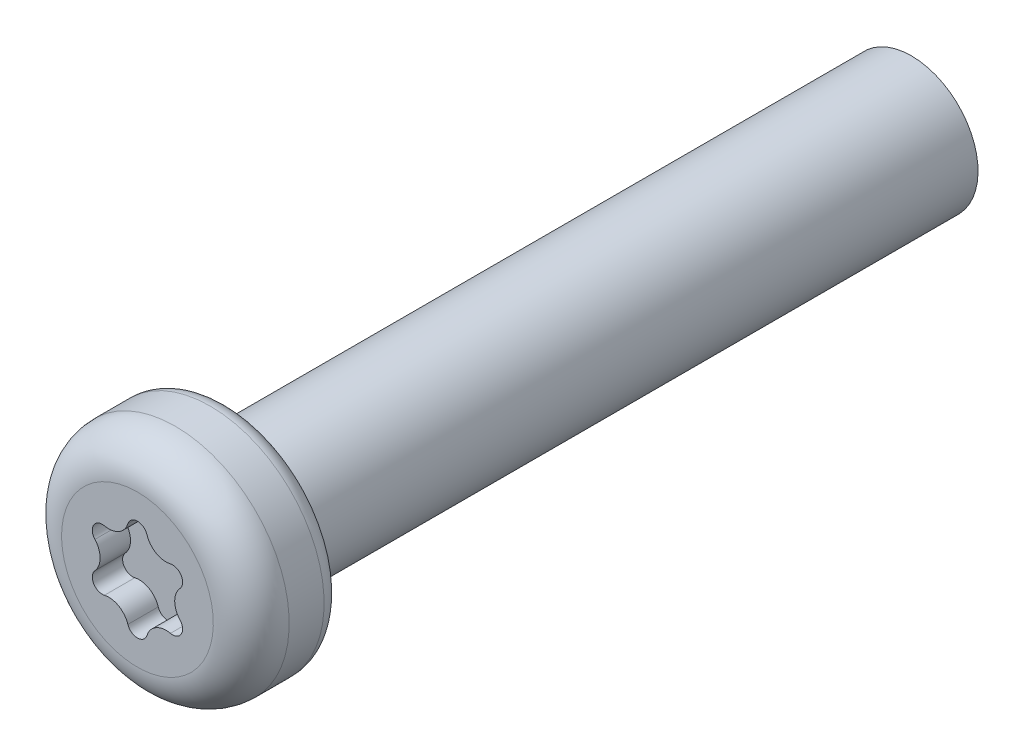
ISO-10303-21;
HEADER;
FILE_DESCRIPTION(('STEP AP214'),'2;1');
FILE_NAME('part.step','',(''),(''),'','','');
FILE_SCHEMA(('AUTOMOTIVE_DESIGN { 1 0 10303 214 1 1 1 1 }'));
ENDSEC;
DATA;
#1=APPLICATION_CONTEXT('core data for automotive mechanical design processes');
#2=APPLICATION_PROTOCOL_DEFINITION('international standard','automotive_design',2000,#1);
#3=PRODUCT_CONTEXT('',#1,'mechanical');
#4=PRODUCT('Part','Part','',(#3));
#5=PRODUCT_RELATED_PRODUCT_CATEGORY('part','',(#4));
#6=PRODUCT_DEFINITION_FORMATION('','',#4);
#7=PRODUCT_DEFINITION_CONTEXT('part definition',#1,'design');
#8=PRODUCT_DEFINITION('design','',#6,#7);
#9=PRODUCT_DEFINITION_SHAPE('','',#8);
#10=(LENGTH_UNIT() NAMED_UNIT(*) SI_UNIT(.MILLI.,.METRE.));
#11=(NAMED_UNIT(*) PLANE_ANGLE_UNIT() SI_UNIT($,.RADIAN.));
#12=(NAMED_UNIT(*) SI_UNIT($,.STERADIAN.) SOLID_ANGLE_UNIT());
#13=UNCERTAINTY_MEASURE_WITH_UNIT(LENGTH_MEASURE(1.E-05),#10,'distance_accuracy_value','');
#14=(GEOMETRIC_REPRESENTATION_CONTEXT(3) GLOBAL_UNCERTAINTY_ASSIGNED_CONTEXT((#13)) GLOBAL_UNIT_ASSIGNED_CONTEXT((#10,
#11,#12)) REPRESENTATION_CONTEXT('',''));
#15=CARTESIAN_POINT('',(0.,0.,0.));
#16=DIRECTION('',(0.,0.,1.));
#17=DIRECTION('',(1.,0.,0.));
#18=AXIS2_PLACEMENT_3D('',#15,#16,#17);
#19=CARTESIAN_POINT('',(0.,0.,0.));
#20=DIRECTION('',(0.,0.,1.));
#21=DIRECTION('',(1.,0.,0.));
#22=AXIS2_PLACEMENT_3D('',#19,#20,#21);
#23=PLANE('',#22);
#24=CARTESIAN_POINT('',(0.,0.,0.));
#25=DIRECTION('',(0.,0.,1.));
#26=DIRECTION('',(1.,0.,0.));
#27=AXIS2_PLACEMENT_3D('',#24,#25,#26);
#28=CIRCLE('',#27,1.17);
#29=CARTESIAN_POINT('',(1.17,0.,0.));
#30=VERTEX_POINT('',#29);
#31=EDGE_CURVE('E45',#30,#30,#28,.F.);
#32=ORIENTED_EDGE('',*,*,#31,.F.);
#33=EDGE_LOOP('',(#32));
#34=FACE_BOUND('',#33,.T.);
#35=CARTESIAN_POINT('',(0.,0.,0.));
#36=DIRECTION('',(0.,0.,-1.));
#37=DIRECTION('',(0.,1.,0.));
#38=AXIS2_PLACEMENT_3D('',#35,#36,#37);
#39=CIRCLE('',#38,1.68);
#40=CARTESIAN_POINT('',(0.,1.68,0.));
#41=VERTEX_POINT('',#40);
#42=EDGE_CURVE('E131',#41,#41,#39,.T.);
#43=ORIENTED_EDGE('',*,*,#42,.T.);
#44=EDGE_LOOP('',(#43));
#45=FACE_BOUND('',#44,.T.);
#46=ADVANCED_FACE('F36',(#34,#45),#23,.F.);
#47=CARTESIAN_POINT('',(0.,0.,0.));
#48=DIRECTION('',(0.,0.,-1.));
#49=DIRECTION('',(0.,1.,0.));
#50=AXIS2_PLACEMENT_3D('',#47,#48,#49);
#51=CYLINDRICAL_SURFACE('',#50,1.17);
#52=ORIENTED_EDGE('',*,*,#31,.T.);
#53=EDGE_LOOP('',(#52));
#54=FACE_BOUND('',#53,.T.);
#55=CARTESIAN_POINT('',(0.,0.,-12.));
#56=DIRECTION('',(0.,0.,-1.));
#57=DIRECTION('',(0.,1.,0.));
#58=AXIS2_PLACEMENT_3D('',#55,#56,#57);
#59=CIRCLE('',#58,1.17);
#60=CARTESIAN_POINT('',(0.,1.17,-12.));
#61=VERTEX_POINT('',#60);
#62=EDGE_CURVE('E11',#61,#61,#59,.T.);
#63=ORIENTED_EDGE('',*,*,#62,.F.);
#64=EDGE_LOOP('',(#63));
#65=FACE_BOUND('',#64,.T.);
#66=ADVANCED_FACE('F38',(#54,#65),#51,.T.);
#67=CARTESIAN_POINT('',(0.,0.,-12.));
#68=DIRECTION('',(0.,0.,-1.));
#69=DIRECTION('',(0.,1.,0.));
#70=AXIS2_PLACEMENT_3D('',#67,#68,#69);
#71=PLANE('',#70);
#72=ORIENTED_EDGE('',*,*,#62,.T.);
#73=EDGE_LOOP('',(#72));
#74=FACE_BOUND('',#73,.T.);
#75=ADVANCED_FACE('F150',(#74),#71,.T.);
#76=CARTESIAN_POINT('',(0.,0.,0.32));
#77=DIRECTION('',(0.,0.,-1.));
#78=DIRECTION('',(0.,1.,0.));
#79=AXIS2_PLACEMENT_3D('',#76,#77,#78);
#80=TOROIDAL_SURFACE('',#79,1.68,0.32);
#81=ORIENTED_EDGE('',*,*,#42,.F.);
#82=EDGE_LOOP('',(#81));
#83=FACE_BOUND('',#82,.T.);
#84=CARTESIAN_POINT('',(0.,0.,0.32));
#85=DIRECTION('',(0.,0.,-1.));
#86=DIRECTION('',(0.,1.,0.));
#87=AXIS2_PLACEMENT_3D('',#84,#85,#86);
#88=CIRCLE('',#87,2.);
#89=CARTESIAN_POINT('',(0.,2.,0.32));
#90=VERTEX_POINT('',#89);
#91=EDGE_CURVE('E128',#90,#90,#88,.T.);
#92=ORIENTED_EDGE('',*,*,#91,.T.);
#93=EDGE_LOOP('',(#92));
#94=FACE_BOUND('',#93,.T.);
#95=ADVANCED_FACE('F146',(#83,#94),#80,.T.);
#96=CARTESIAN_POINT('',(0.,0.,1.6));
#97=DIRECTION('',(0.,0.,-1.));
#98=DIRECTION('',(-1.,0.,0.));
#99=AXIS2_PLACEMENT_3D('',#96,#97,#98);
#100=CYLINDRICAL_SURFACE('',#99,2.);
#101=CARTESIAN_POINT('',(0.,0.,0.933333333333333));
#102=DIRECTION('',(0.,0.,-1.));
#103=DIRECTION('',(0.,1.,0.));
#104=AXIS2_PLACEMENT_3D('',#101,#102,#103);
#105=CIRCLE('',#104,2.);
#106=CARTESIAN_POINT('',(0.,2.,0.933333333333333));
#107=VERTEX_POINT('',#106);
#108=EDGE_CURVE('E124',#107,#107,#105,.T.);
#109=ORIENTED_EDGE('',*,*,#108,.T.);
#110=EDGE_LOOP('',(#109));
#111=FACE_BOUND('',#110,.T.);
#112=ORIENTED_EDGE('',*,*,#91,.F.);
#113=EDGE_LOOP('',(#112));
#114=FACE_BOUND('',#113,.T.);
#115=ADVANCED_FACE('F149',(#111,#114),#100,.T.);
#116=CARTESIAN_POINT('',(0.,0.,0.933333333333333));
#117=DIRECTION('',(0.,0.,-1.));
#118=DIRECTION('',(0.,1.,0.));
#119=AXIS2_PLACEMENT_3D('',#116,#117,#118);
#120=TOROIDAL_SURFACE('',#119,1.33333333333333,0.666666666666667);
#121=ORIENTED_EDGE('',*,*,#108,.F.);
#122=EDGE_LOOP('',(#121));
#123=FACE_BOUND('',#122,.T.);
#124=CARTESIAN_POINT('',(0.,0.,1.6));
#125=DIRECTION('',(0.,0.,-1.));
#126=DIRECTION('',(0.,1.,0.));
#127=AXIS2_PLACEMENT_3D('',#124,#125,#126);
#128=CIRCLE('',#127,1.33333333333333);
#129=CARTESIAN_POINT('',(0.,1.33333333333333,1.6));
#130=VERTEX_POINT('',#129);
#131=EDGE_CURVE('E134',#130,#130,#128,.T.);
#132=ORIENTED_EDGE('',*,*,#131,.T.);
#133=EDGE_LOOP('',(#132));
#134=FACE_BOUND('',#133,.T.);
#135=ADVANCED_FACE('F155',(#123,#134),#120,.T.);
#136=CARTESIAN_POINT('',(0.,0.,1.6));
#137=DIRECTION('',(0.,0.,1.));
#138=DIRECTION('',(1.,0.,0.));
#139=AXIS2_PLACEMENT_3D('',#136,#137,#138);
#140=PLANE('',#139);
#141=CARTESIAN_POINT('',(0.503453491609989,0.87200702671645,1.6));
#142=DIRECTION('',(0.,0.,-1.));
#143=DIRECTION('',(1.,0.,0.));
#144=AXIS2_PLACEMENT_3D('',#141,#142,#143);
#145=CIRCLE('',#144,0.352);
#146=CARTESIAN_POINT('',(0.579404422438957,0.528298638535112,1.6));
#147=VERTEX_POINT('',#146);
#148=CARTESIAN_POINT('',(0.167817830536663,0.765928268164742,1.6));
#149=VERTEX_POINT('',#148);
#150=EDGE_CURVE('E83',#147,#149,#145,.T.);
#151=ORIENTED_EDGE('',*,*,#150,.F.);
#152=CARTESIAN_POINT('',(0.617379887853441,0.356444444444443,1.6));
#153=DIRECTION('',(0.,0.,1.));
#154=DIRECTION('',(-0.499999999999998,0.86602540378444,0.));
#155=AXIS2_PLACEMENT_3D('',#152,#153,#154);
#156=CIRCLE('',#155,0.176);
#157=CARTESIAN_POINT('',(0.747222252975619,0.237629629629627,1.6));
#158=VERTEX_POINT('',#157);
#159=EDGE_CURVE('E88',#158,#147,#156,.T.);
#160=ORIENTED_EDGE('',*,*,#159,.F.);
#161=CARTESIAN_POINT('',(1.00690698321998,0.,1.6));
#162=DIRECTION('',(0.,0.,-1.));
#163=DIRECTION('',(0.499999999999998,-0.86602540378444,0.));
#164=AXIS2_PLACEMENT_3D('',#161,#162,#163);
#165=CIRCLE('',#164,0.352);
#166=CARTESIAN_POINT('',(0.747222252975618,-0.237629629629633,1.6));
#167=VERTEX_POINT('',#166);
#168=EDGE_CURVE('E102',#167,#158,#165,.T.);
#169=ORIENTED_EDGE('',*,*,#168,.F.);
#170=CARTESIAN_POINT('',(0.617379887853438,-0.356444444444448,1.6));
#171=DIRECTION('',(0.,0.,1.));
#172=DIRECTION('',(0.500000000000004,0.866025403784436,0.));
#173=AXIS2_PLACEMENT_3D('',#170,#171,#172);
#174=CIRCLE('',#173,0.176);
#175=CARTESIAN_POINT('',(0.579404422438953,-0.528298638535117,1.6));
#176=VERTEX_POINT('',#175);
#177=EDGE_CURVE('E411',#176,#167,#174,.T.);
#178=ORIENTED_EDGE('',*,*,#177,.F.);
#179=CARTESIAN_POINT('',(0.503453491609983,-0.872007026716454,1.6));
#180=DIRECTION('',(0.,0.,-1.));
#181=DIRECTION('',(-0.500000000000004,-0.866025403784436,0.));
#182=AXIS2_PLACEMENT_3D('',#179,#180,#181);
#183=CIRCLE('',#182,0.352);
#184=CARTESIAN_POINT('',(0.167817830536658,-0.765928268164744,1.6));
#185=VERTEX_POINT('',#184);
#186=EDGE_CURVE('E404',#185,#176,#183,.T.);
#187=ORIENTED_EDGE('',*,*,#186,.F.);
#188=CARTESIAN_POINT('',(0.,-0.712888888888889,1.6));
#189=DIRECTION('',(0.,0.,1.));
#190=DIRECTION('',(1.,0.,0.));
#191=AXIS2_PLACEMENT_3D('',#188,#189,#190);
#192=CIRCLE('',#191,0.176);
#193=CARTESIAN_POINT('',(-0.167817830536668,-0.765928268164742,1.6));
#194=VERTEX_POINT('',#193);
#195=EDGE_CURVE('E393',#194,#185,#192,.T.);
#196=ORIENTED_EDGE('',*,*,#195,.F.);
#197=CARTESIAN_POINT('',(-0.503453491609995,-0.872007026716447,1.6));
#198=DIRECTION('',(0.,0.,-1.));
#199=DIRECTION('',(-1.,0.,0.));
#200=AXIS2_PLACEMENT_3D('',#197,#198,#199);
#201=CIRCLE('',#200,0.352);
#202=CARTESIAN_POINT('',(-0.57940442243896,-0.528298638535108,1.6));
#203=VERTEX_POINT('',#202);
#204=EDGE_CURVE('E385',#203,#194,#201,.T.);
#205=ORIENTED_EDGE('',*,*,#204,.F.);
#206=CARTESIAN_POINT('',(-0.617379887853443,-0.356444444444439,1.6));
#207=DIRECTION('',(0.,0.,1.));
#208=DIRECTION('',(0.499999999999992,-0.866025403784443,0.));
#209=AXIS2_PLACEMENT_3D('',#206,#207,#208);
#210=CIRCLE('',#209,0.176);
#211=CARTESIAN_POINT('',(-0.747222252975621,-0.237629629629622,1.6));
#212=VERTEX_POINT('',#211);
#213=EDGE_CURVE('E372',#212,#203,#210,.T.);
#214=ORIENTED_EDGE('',*,*,#213,.F.);
#215=CARTESIAN_POINT('',(-1.00690698321998,0.,1.6));
#216=DIRECTION('',(0.,0.,-1.));
#217=DIRECTION('',(-0.499999999999992,0.866025403784443,0.));
#218=AXIS2_PLACEMENT_3D('',#215,#216,#217);
#219=CIRCLE('',#218,0.352);
#220=CARTESIAN_POINT('',(-0.747222252975616,0.237629629629638,1.6));
#221=VERTEX_POINT('',#220);
#222=EDGE_CURVE('E368',#221,#212,#219,.T.);
#223=ORIENTED_EDGE('',*,*,#222,.F.);
#224=CARTESIAN_POINT('',(-0.617379887853436,0.356444444444452,1.6));
#225=DIRECTION('',(0.,0.,1.));
#226=DIRECTION('',(-0.50000000000001,-0.866025403784433,0.));
#227=AXIS2_PLACEMENT_3D('',#224,#225,#226);
#228=CIRCLE('',#227,0.176);
#229=CARTESIAN_POINT('',(-0.579404422438949,0.52829863853512,1.6));
#230=VERTEX_POINT('',#229);
#231=EDGE_CURVE('E352',#230,#221,#228,.T.);
#232=ORIENTED_EDGE('',*,*,#231,.F.);
#233=CARTESIAN_POINT('',(-0.503453491609989,0.87200702671645,1.6));
#234=DIRECTION('',(0.,0.,-1.));
#235=DIRECTION('',(1.,0.,0.));
#236=AXIS2_PLACEMENT_3D('',#233,#234,#235);
#237=CIRCLE('',#236,0.352);
#238=CARTESIAN_POINT('',(-0.167817830536663,0.765928268164742,1.6));
#239=VERTEX_POINT('',#238);
#240=EDGE_CURVE('E114',#239,#230,#237,.T.);
#241=ORIENTED_EDGE('',*,*,#240,.F.);
#242=CARTESIAN_POINT('',(0.,0.712888888888889,1.6));
#243=DIRECTION('',(0.,0.,1.));
#244=DIRECTION('',(-1.,0.,0.));
#245=AXIS2_PLACEMENT_3D('',#242,#243,#244);
#246=CIRCLE('',#245,0.176);
#247=EDGE_CURVE('E90',#149,#239,#246,.T.);
#248=ORIENTED_EDGE('',*,*,#247,.F.);
#249=EDGE_LOOP('',(#151,#160,#169,#178,#187,#196,#205,#214,#223,#232,#241,#248));
#250=FACE_BOUND('',#249,.T.);
#251=ORIENTED_EDGE('',*,*,#131,.F.);
#252=EDGE_LOOP('',(#251));
#253=FACE_BOUND('',#252,.T.);
#254=ADVANCED_FACE('F84',(#250,#253),#140,.T.);
#255=CARTESIAN_POINT('',(-0.503453491609989,0.87200702671645,1.06666666666667));
#256=DIRECTION('',(0.,0.,1.));
#257=DIRECTION('',(1.,0.,0.));
#258=AXIS2_PLACEMENT_3D('',#255,#256,#257);
#259=CYLINDRICAL_SURFACE('',#258,0.352);
#260=ORIENTED_EDGE('',*,*,#240,.T.);
#261=DIRECTION('',(0.,0.,1.));
#262=VECTOR('',#261,1.);
#263=CARTESIAN_POINT('',(-0.579404422438949,0.52829863853512,1.06666666666667));
#264=LINE('',#263,#262);
#265=CARTESIAN_POINT('',(-0.579404422438949,0.52829863853512,1.06666666666667));
#266=VERTEX_POINT('',#265);
#267=EDGE_CURVE('E361',#266,#230,#264,.T.);
#268=ORIENTED_EDGE('',*,*,#267,.F.);
#269=CARTESIAN_POINT('',(-0.503453491609989,0.87200702671645,1.06666666666667));
#270=DIRECTION('',(0.,0.,-1.));
#271=DIRECTION('',(1.,0.,0.));
#272=AXIS2_PLACEMENT_3D('',#269,#270,#271);
#273=CIRCLE('',#272,0.352);
#274=CARTESIAN_POINT('',(-0.167817830536663,0.765928268164742,1.06666666666667));
#275=VERTEX_POINT('',#274);
#276=EDGE_CURVE('E117',#275,#266,#273,.T.);
#277=ORIENTED_EDGE('',*,*,#276,.F.);
#278=DIRECTION('',(0.,0.,1.));
#279=VECTOR('',#278,1.);
#280=CARTESIAN_POINT('',(-0.167817830536663,0.765928268164742,1.06666666666667));
#281=LINE('',#280,#279);
#282=EDGE_CURVE('E53',#275,#239,#281,.T.);
#283=ORIENTED_EDGE('',*,*,#282,.T.);
#284=EDGE_LOOP('',(#260,#268,#277,#283));
#285=FACE_BOUND('',#284,.T.);
#286=ADVANCED_FACE('F207',(#285),#259,.T.);
#287=CARTESIAN_POINT('',(0.,0.712888888888889,1.06666666666667));
#288=DIRECTION('',(0.,0.,1.));
#289=DIRECTION('',(1.,0.,0.));
#290=AXIS2_PLACEMENT_3D('',#287,#288,#289);
#291=CYLINDRICAL_SURFACE('',#290,0.176);
#292=ORIENTED_EDGE('',*,*,#247,.T.);
#293=ORIENTED_EDGE('',*,*,#282,.F.);
#294=CARTESIAN_POINT('',(0.,0.712888888888889,1.06666666666667));
#295=DIRECTION('',(0.,0.,1.));
#296=DIRECTION('',(-1.,0.,0.));
#297=AXIS2_PLACEMENT_3D('',#294,#295,#296);
#298=CIRCLE('',#297,0.176);
#299=CARTESIAN_POINT('',(0.167817830536663,0.765928268164742,1.06666666666667));
#300=VERTEX_POINT('',#299);
#301=EDGE_CURVE('E113',#300,#275,#298,.T.);
#302=ORIENTED_EDGE('',*,*,#301,.F.);
#303=DIRECTION('',(0.,0.,1.));
#304=VECTOR('',#303,1.);
#305=CARTESIAN_POINT('',(0.167817830536663,0.765928268164742,1.06666666666667));
#306=LINE('',#305,#304);
#307=EDGE_CURVE('E61',#300,#149,#306,.T.);
#308=ORIENTED_EDGE('',*,*,#307,.T.);
#309=EDGE_LOOP('',(#292,#293,#302,#308));
#310=FACE_BOUND('',#309,.T.);
#311=ADVANCED_FACE('F202',(#310),#291,.F.);
#312=CARTESIAN_POINT('',(0.503453491609989,0.87200702671645,1.06666666666667));
#313=DIRECTION('',(0.,0.,1.));
#314=DIRECTION('',(1.,0.,0.));
#315=AXIS2_PLACEMENT_3D('',#312,#313,#314);
#316=CYLINDRICAL_SURFACE('',#315,0.352);
#317=ORIENTED_EDGE('',*,*,#150,.T.);
#318=ORIENTED_EDGE('',*,*,#307,.F.);
#319=CARTESIAN_POINT('',(0.503453491609989,0.87200702671645,1.06666666666667));
#320=DIRECTION('',(0.,0.,-1.));
#321=DIRECTION('',(1.,0.,0.));
#322=AXIS2_PLACEMENT_3D('',#319,#320,#321);
#323=CIRCLE('',#322,0.352);
#324=CARTESIAN_POINT('',(0.579404422438957,0.528298638535112,1.06666666666667));
#325=VERTEX_POINT('',#324);
#326=EDGE_CURVE('E69',#325,#300,#323,.T.);
#327=ORIENTED_EDGE('',*,*,#326,.F.);
#328=DIRECTION('',(0.,0.,1.));
#329=VECTOR('',#328,1.);
#330=CARTESIAN_POINT('',(0.579404422438957,0.528298638535112,1.06666666666667));
#331=LINE('',#330,#329);
#332=EDGE_CURVE('E91',#325,#147,#331,.T.);
#333=ORIENTED_EDGE('',*,*,#332,.T.);
#334=EDGE_LOOP('',(#317,#318,#327,#333));
#335=FACE_BOUND('',#334,.T.);
#336=ADVANCED_FACE('F93',(#335),#316,.T.);
#337=CARTESIAN_POINT('',(0.503453491609989,0.87200702671645,1.06666666666667));
#338=DIRECTION('',(0.,0.,1.));
#339=DIRECTION('',(1.,0.,0.));
#340=AXIS2_PLACEMENT_3D('',#337,#338,#339);
#341=PLANE('',#340);
#342=CARTESIAN_POINT('',(0.617379887853441,0.356444444444443,1.06666666666667));
#343=DIRECTION('',(0.,0.,1.));
#344=DIRECTION('',(-0.499999999999998,0.86602540378444,0.));
#345=AXIS2_PLACEMENT_3D('',#342,#343,#344);
#346=CIRCLE('',#345,0.176);
#347=CARTESIAN_POINT('',(0.747222252975619,0.237629629629627,1.06666666666667));
#348=VERTEX_POINT('',#347);
#349=EDGE_CURVE('E105',#348,#325,#346,.T.);
#350=ORIENTED_EDGE('',*,*,#349,.T.);
#351=ORIENTED_EDGE('',*,*,#326,.T.);
#352=ORIENTED_EDGE('',*,*,#301,.T.);
#353=ORIENTED_EDGE('',*,*,#276,.T.);
#354=CARTESIAN_POINT('',(-0.617379887853436,0.356444444444452,1.06666666666667));
#355=DIRECTION('',(0.,0.,1.));
#356=DIRECTION('',(-0.50000000000001,-0.866025403784433,0.));
#357=AXIS2_PLACEMENT_3D('',#354,#355,#356);
#358=CIRCLE('',#357,0.176);
#359=CARTESIAN_POINT('',(-0.747222252975616,0.237629629629638,1.06666666666667));
#360=VERTEX_POINT('',#359);
#361=EDGE_CURVE('E364',#266,#360,#358,.T.);
#362=ORIENTED_EDGE('',*,*,#361,.T.);
#363=CARTESIAN_POINT('',(-1.00690698321998,0.,1.06666666666667));
#364=DIRECTION('',(0.,0.,-1.));
#365=DIRECTION('',(-0.499999999999992,0.866025403784443,0.));
#366=AXIS2_PLACEMENT_3D('',#363,#364,#365);
#367=CIRCLE('',#366,0.352);
#368=CARTESIAN_POINT('',(-0.747222252975621,-0.237629629629622,1.06666666666667));
#369=VERTEX_POINT('',#368);
#370=EDGE_CURVE('E375',#360,#369,#367,.T.);
#371=ORIENTED_EDGE('',*,*,#370,.T.);
#372=CARTESIAN_POINT('',(-0.617379887853443,-0.356444444444439,1.06666666666667));
#373=DIRECTION('',(0.,0.,1.));
#374=DIRECTION('',(0.499999999999992,-0.866025403784443,0.));
#375=AXIS2_PLACEMENT_3D('',#372,#373,#374);
#376=CIRCLE('',#375,0.176);
#377=CARTESIAN_POINT('',(-0.57940442243896,-0.528298638535108,1.06666666666667));
#378=VERTEX_POINT('',#377);
#379=EDGE_CURVE('E379',#369,#378,#376,.T.);
#380=ORIENTED_EDGE('',*,*,#379,.T.);
#381=CARTESIAN_POINT('',(-0.503453491609995,-0.872007026716446,1.06666666666667));
#382=DIRECTION('',(0.,0.,-1.));
#383=DIRECTION('',(-1.,0.,0.));
#384=AXIS2_PLACEMENT_3D('',#381,#382,#383);
#385=CIRCLE('',#384,0.352);
#386=CARTESIAN_POINT('',(-0.167817830536668,-0.765928268164742,1.06666666666667));
#387=VERTEX_POINT('',#386);
#388=EDGE_CURVE('E389',#378,#387,#385,.T.);
#389=ORIENTED_EDGE('',*,*,#388,.T.);
#390=CARTESIAN_POINT('',(0.,-0.712888888888889,1.06666666666667));
#391=DIRECTION('',(0.,0.,1.));
#392=DIRECTION('',(1.,0.,0.));
#393=AXIS2_PLACEMENT_3D('',#390,#391,#392);
#394=CIRCLE('',#393,0.176);
#395=CARTESIAN_POINT('',(0.167817830536658,-0.765928268164744,1.06666666666667));
#396=VERTEX_POINT('',#395);
#397=EDGE_CURVE('E392',#387,#396,#394,.T.);
#398=ORIENTED_EDGE('',*,*,#397,.T.);
#399=CARTESIAN_POINT('',(0.503453491609983,-0.872007026716454,1.06666666666667));
#400=DIRECTION('',(0.,0.,-1.));
#401=DIRECTION('',(-0.500000000000004,-0.866025403784436,0.));
#402=AXIS2_PLACEMENT_3D('',#399,#400,#401);
#403=CIRCLE('',#402,0.352);
#404=CARTESIAN_POINT('',(0.579404422438953,-0.528298638535116,1.06666666666667));
#405=VERTEX_POINT('',#404);
#406=EDGE_CURVE('E407',#396,#405,#403,.T.);
#407=ORIENTED_EDGE('',*,*,#406,.T.);
#408=CARTESIAN_POINT('',(0.617379887853438,-0.356444444444448,1.06666666666667));
#409=DIRECTION('',(0.,0.,1.));
#410=DIRECTION('',(0.500000000000004,0.866025403784436,0.));
#411=AXIS2_PLACEMENT_3D('',#408,#409,#410);
#412=CIRCLE('',#411,0.176);
#413=CARTESIAN_POINT('',(0.747222252975618,-0.237629629629633,1.06666666666667));
#414=VERTEX_POINT('',#413);
#415=EDGE_CURVE('E410',#405,#414,#412,.T.);
#416=ORIENTED_EDGE('',*,*,#415,.T.);
#417=CARTESIAN_POINT('',(1.00690698321998,0.,1.06666666666667));
#418=DIRECTION('',(0.,0.,-1.));
#419=DIRECTION('',(0.499999999999998,-0.86602540378444,0.));
#420=AXIS2_PLACEMENT_3D('',#417,#418,#419);
#421=CIRCLE('',#420,0.352);
#422=EDGE_CURVE('E101',#414,#348,#421,.T.);
#423=ORIENTED_EDGE('',*,*,#422,.T.);
#424=EDGE_LOOP('',(#350,#351,#352,#353,#362,#371,#380,#389,#398,#407,#416,#423));
#425=FACE_BOUND('',#424,.T.);
#426=ADVANCED_FACE('F233',(#425),#341,.T.);
#427=CARTESIAN_POINT('',(0.617379887853441,0.356444444444443,1.06666666666667));
#428=DIRECTION('',(0.,0.,1.));
#429=DIRECTION('',(1.,0.,0.));
#430=AXIS2_PLACEMENT_3D('',#427,#428,#429);
#431=CYLINDRICAL_SURFACE('',#430,0.176);
#432=ORIENTED_EDGE('',*,*,#159,.T.);
#433=ORIENTED_EDGE('',*,*,#332,.F.);
#434=ORIENTED_EDGE('',*,*,#349,.F.);
#435=DIRECTION('',(0.,0.,1.));
#436=VECTOR('',#435,1.);
#437=CARTESIAN_POINT('',(0.747222252975619,0.237629629629627,1.06666666666667));
#438=LINE('',#437,#436);
#439=EDGE_CURVE('E97',#348,#158,#438,.T.);
#440=ORIENTED_EDGE('',*,*,#439,.T.);
#441=EDGE_LOOP('',(#432,#433,#434,#440));
#442=FACE_BOUND('',#441,.T.);
#443=ADVANCED_FACE('F99',(#442),#431,.F.);
#444=CARTESIAN_POINT('',(1.00690698321998,0.,1.06666666666667));
#445=DIRECTION('',(0.,0.,1.));
#446=DIRECTION('',(1.,0.,0.));
#447=AXIS2_PLACEMENT_3D('',#444,#445,#446);
#448=CYLINDRICAL_SURFACE('',#447,0.352);
#449=ORIENTED_EDGE('',*,*,#168,.T.);
#450=ORIENTED_EDGE('',*,*,#439,.F.);
#451=ORIENTED_EDGE('',*,*,#422,.F.);
#452=DIRECTION('',(0.,0.,1.));
#453=VECTOR('',#452,1.);
#454=CARTESIAN_POINT('',(0.747222252975618,-0.237629629629633,1.06666666666667));
#455=LINE('',#454,#453);
#456=EDGE_CURVE('E107',#414,#167,#455,.T.);
#457=ORIENTED_EDGE('',*,*,#456,.T.);
#458=EDGE_LOOP('',(#449,#450,#451,#457));
#459=FACE_BOUND('',#458,.T.);
#460=ADVANCED_FACE('F252',(#459),#448,.T.);
#461=CARTESIAN_POINT('',(0.617379887853438,-0.356444444444448,1.06666666666667));
#462=DIRECTION('',(0.,0.,1.));
#463=DIRECTION('',(0.,-1.,0.));
#464=AXIS2_PLACEMENT_3D('',#461,#462,#463);
#465=CYLINDRICAL_SURFACE('',#464,0.176);
#466=ORIENTED_EDGE('',*,*,#177,.T.);
#467=ORIENTED_EDGE('',*,*,#456,.F.);
#468=ORIENTED_EDGE('',*,*,#415,.F.);
#469=DIRECTION('',(0.,0.,1.));
#470=VECTOR('',#469,1.);
#471=CARTESIAN_POINT('',(0.579404422438953,-0.528298638535116,1.06666666666667));
#472=LINE('',#471,#470);
#473=EDGE_CURVE('E414',#405,#176,#472,.T.);
#474=ORIENTED_EDGE('',*,*,#473,.T.);
#475=EDGE_LOOP('',(#466,#467,#468,#474));
#476=FACE_BOUND('',#475,.T.);
#477=ADVANCED_FACE('F264',(#476),#465,.F.);
#478=CARTESIAN_POINT('',(0.503453491609983,-0.872007026716454,1.06666666666667));
#479=DIRECTION('',(0.,0.,1.));
#480=DIRECTION('',(0.,-1.,0.));
#481=AXIS2_PLACEMENT_3D('',#478,#479,#480);
#482=CYLINDRICAL_SURFACE('',#481,0.352);
#483=ORIENTED_EDGE('',*,*,#186,.T.);
#484=ORIENTED_EDGE('',*,*,#473,.F.);
#485=ORIENTED_EDGE('',*,*,#406,.F.);
#486=DIRECTION('',(0.,0.,1.));
#487=VECTOR('',#486,1.);
#488=CARTESIAN_POINT('',(0.167817830536658,-0.765928268164744,1.06666666666667));
#489=LINE('',#488,#487);
#490=EDGE_CURVE('E401',#396,#185,#489,.T.);
#491=ORIENTED_EDGE('',*,*,#490,.T.);
#492=EDGE_LOOP('',(#483,#484,#485,#491));
#493=FACE_BOUND('',#492,.T.);
#494=ADVANCED_FACE('F276',(#493),#482,.T.);
#495=CARTESIAN_POINT('',(0.,-0.712888888888889,1.06666666666667));
#496=DIRECTION('',(0.,0.,1.));
#497=DIRECTION('',(0.,-1.,0.));
#498=AXIS2_PLACEMENT_3D('',#495,#496,#497);
#499=CYLINDRICAL_SURFACE('',#498,0.176);
#500=ORIENTED_EDGE('',*,*,#195,.T.);
#501=ORIENTED_EDGE('',*,*,#490,.F.);
#502=ORIENTED_EDGE('',*,*,#397,.F.);
#503=DIRECTION('',(0.,0.,1.));
#504=VECTOR('',#503,1.);
#505=CARTESIAN_POINT('',(-0.167817830536668,-0.765928268164742,1.06666666666667));
#506=LINE('',#505,#504);
#507=EDGE_CURVE('E396',#387,#194,#506,.T.);
#508=ORIENTED_EDGE('',*,*,#507,.T.);
#509=EDGE_LOOP('',(#500,#501,#502,#508));
#510=FACE_BOUND('',#509,.T.);
#511=ADVANCED_FACE('F288',(#510),#499,.F.);
#512=CARTESIAN_POINT('',(-0.503453491609995,-0.872007026716446,1.06666666666667));
#513=DIRECTION('',(0.,0.,1.));
#514=DIRECTION('',(0.,-1.,0.));
#515=AXIS2_PLACEMENT_3D('',#512,#513,#514);
#516=CYLINDRICAL_SURFACE('',#515,0.352);
#517=ORIENTED_EDGE('',*,*,#204,.T.);
#518=ORIENTED_EDGE('',*,*,#507,.F.);
#519=ORIENTED_EDGE('',*,*,#388,.F.);
#520=DIRECTION('',(0.,0.,1.));
#521=VECTOR('',#520,1.);
#522=CARTESIAN_POINT('',(-0.57940442243896,-0.528298638535108,1.06666666666667));
#523=LINE('',#522,#521);
#524=EDGE_CURVE('E382',#378,#203,#523,.T.);
#525=ORIENTED_EDGE('',*,*,#524,.T.);
#526=EDGE_LOOP('',(#517,#518,#519,#525));
#527=FACE_BOUND('',#526,.T.);
#528=ADVANCED_FACE('F299',(#527),#516,.T.);
#529=CARTESIAN_POINT('',(-0.617379887853443,-0.356444444444439,1.06666666666667));
#530=DIRECTION('',(0.,0.,1.));
#531=DIRECTION('',(0.,-1.,0.));
#532=AXIS2_PLACEMENT_3D('',#529,#530,#531);
#533=CYLINDRICAL_SURFACE('',#532,0.176);
#534=ORIENTED_EDGE('',*,*,#213,.T.);
#535=ORIENTED_EDGE('',*,*,#524,.F.);
#536=ORIENTED_EDGE('',*,*,#379,.F.);
#537=DIRECTION('',(0.,0.,1.));
#538=VECTOR('',#537,1.);
#539=CARTESIAN_POINT('',(-0.747222252975621,-0.237629629629622,1.06666666666667));
#540=LINE('',#539,#538);
#541=EDGE_CURVE('E386',#369,#212,#540,.T.);
#542=ORIENTED_EDGE('',*,*,#541,.T.);
#543=EDGE_LOOP('',(#534,#535,#536,#542));
#544=FACE_BOUND('',#543,.T.);
#545=ADVANCED_FACE('F311',(#544),#533,.F.);
#546=CARTESIAN_POINT('',(-1.00690698321998,0.,1.06666666666667));
#547=DIRECTION('',(0.,0.,1.));
#548=DIRECTION('',(0.,-1.,0.));
#549=AXIS2_PLACEMENT_3D('',#546,#547,#548);
#550=CYLINDRICAL_SURFACE('',#549,0.352);
#551=ORIENTED_EDGE('',*,*,#222,.T.);
#552=ORIENTED_EDGE('',*,*,#541,.F.);
#553=ORIENTED_EDGE('',*,*,#370,.F.);
#554=DIRECTION('',(0.,0.,1.));
#555=VECTOR('',#554,1.);
#556=CARTESIAN_POINT('',(-0.747222252975616,0.237629629629638,1.06666666666667));
#557=LINE('',#556,#555);
#558=EDGE_CURVE('E357',#360,#221,#557,.T.);
#559=ORIENTED_EDGE('',*,*,#558,.T.);
#560=EDGE_LOOP('',(#551,#552,#553,#559));
#561=FACE_BOUND('',#560,.T.);
#562=ADVANCED_FACE('F321',(#561),#550,.T.);
#563=CARTESIAN_POINT('',(-0.617379887853436,0.356444444444452,1.06666666666667));
#564=DIRECTION('',(0.,0.,1.));
#565=DIRECTION('',(1.,0.,0.));
#566=AXIS2_PLACEMENT_3D('',#563,#564,#565);
#567=CYLINDRICAL_SURFACE('',#566,0.176);
#568=ORIENTED_EDGE('',*,*,#231,.T.);
#569=ORIENTED_EDGE('',*,*,#558,.F.);
#570=ORIENTED_EDGE('',*,*,#361,.F.);
#571=ORIENTED_EDGE('',*,*,#267,.T.);
#572=EDGE_LOOP('',(#568,#569,#570,#571));
#573=FACE_BOUND('',#572,.T.);
#574=ADVANCED_FACE('F332',(#573),#567,.F.);
#575=CLOSED_SHELL('',(#46,#66,#75,#95,#115,#135,#254,#286,#311,#336,#426,#443,#460,#477,#494,
#511,#528,#545,#562,#574));
#576=MANIFOLD_SOLID_BREP('B2',#575);
#577=ADVANCED_BREP_SHAPE_REPRESENTATION('',(#18,#576),#14);
#578=SHAPE_DEFINITION_REPRESENTATION(#9,#577);
ENDSEC;
END-ISO-10303-21;
